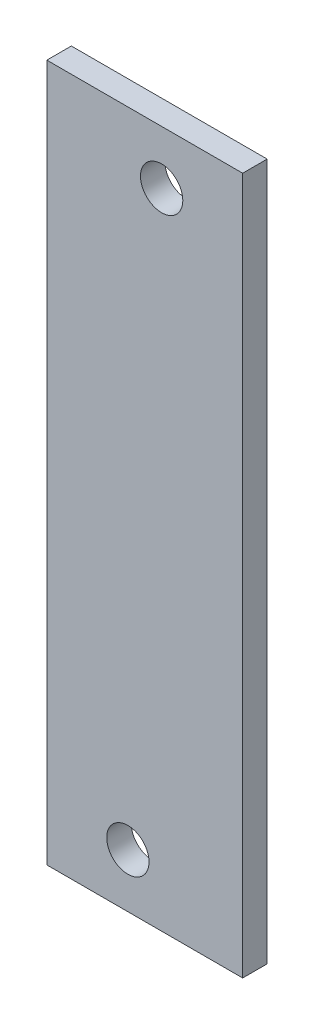
ISO-10303-21;
HEADER;
FILE_DESCRIPTION(('STEP AP214'),'2;1');
FILE_NAME('part.step','',(''),(''),'','','');
FILE_SCHEMA(('AUTOMOTIVE_DESIGN { 1 0 10303 214 1 1 1 1 }'));
ENDSEC;
DATA;
#1=APPLICATION_CONTEXT('core data for automotive mechanical design processes');
#2=APPLICATION_PROTOCOL_DEFINITION('international standard','automotive_design',2000,#1);
#3=PRODUCT_CONTEXT('',#1,'mechanical');
#4=PRODUCT('Part','Part','',(#3));
#5=PRODUCT_RELATED_PRODUCT_CATEGORY('part','',(#4));
#6=PRODUCT_DEFINITION_FORMATION('','',#4);
#7=PRODUCT_DEFINITION_CONTEXT('part definition',#1,'design');
#8=PRODUCT_DEFINITION('design','',#6,#7);
#9=PRODUCT_DEFINITION_SHAPE('','',#8);
#10=(LENGTH_UNIT() NAMED_UNIT(*) SI_UNIT(.MILLI.,.METRE.));
#11=(NAMED_UNIT(*) PLANE_ANGLE_UNIT() SI_UNIT($,.RADIAN.));
#12=(NAMED_UNIT(*) SI_UNIT($,.STERADIAN.) SOLID_ANGLE_UNIT());
#13=UNCERTAINTY_MEASURE_WITH_UNIT(LENGTH_MEASURE(1.E-05),#10,'distance_accuracy_value','');
#14=(GEOMETRIC_REPRESENTATION_CONTEXT(3) GLOBAL_UNCERTAINTY_ASSIGNED_CONTEXT((#13)) GLOBAL_UNIT_ASSIGNED_CONTEXT((#10,
#11,#12)) REPRESENTATION_CONTEXT('',''));
#15=CARTESIAN_POINT('',(0.,0.,0.));
#16=DIRECTION('',(0.,0.,1.));
#17=DIRECTION('',(1.,0.,0.));
#18=AXIS2_PLACEMENT_3D('',#15,#16,#17);
#19=CARTESIAN_POINT('',(0.,0.,3.5));
#20=DIRECTION('',(0.,0.,1.));
#21=DIRECTION('',(1.,0.,0.));
#22=AXIS2_PLACEMENT_3D('',#19,#20,#21);
#23=PLANE('',#22);
#24=CARTESIAN_POINT('',(-2.41299999999999,-42.164,3.5));
#25=DIRECTION('',(0.,0.,1.));
#26=DIRECTION('',(1.,0.,0.));
#27=AXIS2_PLACEMENT_3D('',#24,#25,#26);
#28=CIRCLE('',#27,3.025);
#29=CARTESIAN_POINT('',(0.612000000000011,-42.164,3.5));
#30=VERTEX_POINT('',#29);
#31=EDGE_CURVE('E102',#30,#30,#28,.T.);
#32=ORIENTED_EDGE('',*,*,#31,.F.);
#33=EDGE_LOOP('',(#32));
#34=FACE_BOUND('',#33,.T.);
#35=DIRECTION('',(0.,1.,0.));
#36=VECTOR('',#35,1.);
#37=CARTESIAN_POINT('',(14.,49.83,3.5));
#38=LINE('',#37,#36);
#39=CARTESIAN_POINT('',(14.,-49.83,3.5));
#40=VERTEX_POINT('',#39);
#41=CARTESIAN_POINT('',(14.,49.83,3.5));
#42=VERTEX_POINT('',#41);
#43=EDGE_CURVE('E87',#40,#42,#38,.T.);
#44=ORIENTED_EDGE('',*,*,#43,.T.);
#45=DIRECTION('',(-1.,0.,0.));
#46=VECTOR('',#45,1.);
#47=CARTESIAN_POINT('',(-14.,49.83,3.5));
#48=LINE('',#47,#46);
#49=CARTESIAN_POINT('',(-14.,49.83,3.5));
#50=VERTEX_POINT('',#49);
#51=EDGE_CURVE('E82',#42,#50,#48,.T.);
#52=ORIENTED_EDGE('',*,*,#51,.T.);
#53=DIRECTION('',(0.,-1.,0.));
#54=VECTOR('',#53,1.);
#55=CARTESIAN_POINT('',(-14.,49.83,3.5));
#56=LINE('',#55,#54);
#57=CARTESIAN_POINT('',(-14.,-49.83,3.5));
#58=VERTEX_POINT('',#57);
#59=EDGE_CURVE('E85',#50,#58,#56,.T.);
#60=ORIENTED_EDGE('',*,*,#59,.T.);
#61=DIRECTION('',(1.,0.,0.));
#62=VECTOR('',#61,1.);
#63=CARTESIAN_POINT('',(-14.,-49.83,3.5));
#64=LINE('',#63,#62);
#65=EDGE_CURVE('E52',#58,#40,#64,.T.);
#66=ORIENTED_EDGE('',*,*,#65,.T.);
#67=EDGE_LOOP('',(#44,#52,#60,#66));
#68=FACE_BOUND('',#67,.T.);
#69=CARTESIAN_POINT('',(2.413,42.164,3.5));
#70=DIRECTION('',(0.,0.,1.));
#71=DIRECTION('',(1.,0.,0.));
#72=AXIS2_PLACEMENT_3D('',#69,#70,#71);
#73=CIRCLE('',#72,3.025);
#74=CARTESIAN_POINT('',(5.438,42.164,3.5));
#75=VERTEX_POINT('',#74);
#76=EDGE_CURVE('E117',#75,#75,#73,.T.);
#77=ORIENTED_EDGE('',*,*,#76,.F.);
#78=EDGE_LOOP('',(#77));
#79=FACE_BOUND('',#78,.T.);
#80=ADVANCED_FACE('F35',(#34,#68,#79),#23,.T.);
#81=CARTESIAN_POINT('',(0.,0.,0.));
#82=DIRECTION('',(0.,0.,1.));
#83=DIRECTION('',(1.,0.,0.));
#84=AXIS2_PLACEMENT_3D('',#81,#82,#83);
#85=PLANE('',#84);
#86=DIRECTION('',(0.,1.,0.));
#87=VECTOR('',#86,1.);
#88=CARTESIAN_POINT('',(14.,49.83,0.));
#89=LINE('',#88,#87);
#90=CARTESIAN_POINT('',(14.,-49.83,0.));
#91=VERTEX_POINT('',#90);
#92=CARTESIAN_POINT('',(14.,49.83,0.));
#93=VERTEX_POINT('',#92);
#94=EDGE_CURVE('E99',#91,#93,#89,.T.);
#95=ORIENTED_EDGE('',*,*,#94,.F.);
#96=DIRECTION('',(1.,0.,0.));
#97=VECTOR('',#96,1.);
#98=CARTESIAN_POINT('',(-14.,-49.83,0.));
#99=LINE('',#98,#97);
#100=CARTESIAN_POINT('',(-14.,-49.83,0.));
#101=VERTEX_POINT('',#100);
#102=EDGE_CURVE('E75',#101,#91,#99,.T.);
#103=ORIENTED_EDGE('',*,*,#102,.F.);
#104=DIRECTION('',(0.,-1.,0.));
#105=VECTOR('',#104,1.);
#106=CARTESIAN_POINT('',(-14.,49.83,0.));
#107=LINE('',#106,#105);
#108=CARTESIAN_POINT('',(-14.,49.83,0.));
#109=VERTEX_POINT('',#108);
#110=EDGE_CURVE('E69',#109,#101,#107,.T.);
#111=ORIENTED_EDGE('',*,*,#110,.F.);
#112=DIRECTION('',(-1.,0.,0.));
#113=VECTOR('',#112,1.);
#114=CARTESIAN_POINT('',(-14.,49.83,0.));
#115=LINE('',#114,#113);
#116=EDGE_CURVE('E91',#93,#109,#115,.T.);
#117=ORIENTED_EDGE('',*,*,#116,.F.);
#118=EDGE_LOOP('',(#95,#103,#111,#117));
#119=FACE_BOUND('',#118,.T.);
#120=CARTESIAN_POINT('',(-2.41299999999999,-42.164,0.));
#121=DIRECTION('',(0.,0.,1.));
#122=DIRECTION('',(1.,0.,0.));
#123=AXIS2_PLACEMENT_3D('',#120,#121,#122);
#124=CIRCLE('',#123,3.025);
#125=CARTESIAN_POINT('',(0.612000000000011,-42.164,0.));
#126=VERTEX_POINT('',#125);
#127=EDGE_CURVE('E114',#126,#126,#124,.T.);
#128=ORIENTED_EDGE('',*,*,#127,.T.);
#129=EDGE_LOOP('',(#128));
#130=FACE_BOUND('',#129,.T.);
#131=CARTESIAN_POINT('',(2.413,42.164,0.));
#132=DIRECTION('',(0.,0.,1.));
#133=DIRECTION('',(1.,0.,0.));
#134=AXIS2_PLACEMENT_3D('',#131,#132,#133);
#135=CIRCLE('',#134,3.025);
#136=CARTESIAN_POINT('',(5.438,42.164,0.));
#137=VERTEX_POINT('',#136);
#138=EDGE_CURVE('E120',#137,#137,#135,.T.);
#139=ORIENTED_EDGE('',*,*,#138,.T.);
#140=EDGE_LOOP('',(#139));
#141=FACE_BOUND('',#140,.T.);
#142=ADVANCED_FACE('F110',(#119,#130,#141),#85,.F.);
#143=CARTESIAN_POINT('',(14.,49.83,3.5));
#144=DIRECTION('',(-1.,0.,0.));
#145=DIRECTION('',(0.,-1.,0.));
#146=AXIS2_PLACEMENT_3D('',#143,#144,#145);
#147=PLANE('',#146);
#148=ORIENTED_EDGE('',*,*,#94,.T.);
#149=DIRECTION('',(0.,0.,-1.));
#150=VECTOR('',#149,1.);
#151=CARTESIAN_POINT('',(14.,49.83,3.5));
#152=LINE('',#151,#150);
#153=EDGE_CURVE('E11',#42,#93,#152,.T.);
#154=ORIENTED_EDGE('',*,*,#153,.F.);
#155=ORIENTED_EDGE('',*,*,#43,.F.);
#156=DIRECTION('',(0.,0.,-1.));
#157=VECTOR('',#156,1.);
#158=CARTESIAN_POINT('',(14.,-49.83,3.5));
#159=LINE('',#158,#157);
#160=EDGE_CURVE('E95',#40,#91,#159,.T.);
#161=ORIENTED_EDGE('',*,*,#160,.T.);
#162=EDGE_LOOP('',(#148,#154,#155,#161));
#163=FACE_BOUND('',#162,.T.);
#164=ADVANCED_FACE('F37',(#163),#147,.F.);
#165=CARTESIAN_POINT('',(-14.,49.83,3.5));
#166=DIRECTION('',(0.,-1.,0.));
#167=DIRECTION('',(0.,0.,-1.));
#168=AXIS2_PLACEMENT_3D('',#165,#166,#167);
#169=PLANE('',#168);
#170=ORIENTED_EDGE('',*,*,#116,.T.);
#171=DIRECTION('',(0.,0.,-1.));
#172=VECTOR('',#171,1.);
#173=CARTESIAN_POINT('',(-14.,49.83,3.5));
#174=LINE('',#173,#172);
#175=EDGE_CURVE('E44',#50,#109,#174,.T.);
#176=ORIENTED_EDGE('',*,*,#175,.F.);
#177=ORIENTED_EDGE('',*,*,#51,.F.);
#178=ORIENTED_EDGE('',*,*,#153,.T.);
#179=EDGE_LOOP('',(#170,#176,#177,#178));
#180=FACE_BOUND('',#179,.T.);
#181=ADVANCED_FACE('F90',(#180),#169,.F.);
#182=CARTESIAN_POINT('',(-14.,49.83,3.5));
#183=DIRECTION('',(1.,0.,0.));
#184=DIRECTION('',(0.,1.,0.));
#185=AXIS2_PLACEMENT_3D('',#182,#183,#184);
#186=PLANE('',#185);
#187=ORIENTED_EDGE('',*,*,#110,.T.);
#188=DIRECTION('',(0.,0.,-1.));
#189=VECTOR('',#188,1.);
#190=CARTESIAN_POINT('',(-14.,-49.83,3.5));
#191=LINE('',#190,#189);
#192=EDGE_CURVE('E92',#58,#101,#191,.T.);
#193=ORIENTED_EDGE('',*,*,#192,.F.);
#194=ORIENTED_EDGE('',*,*,#59,.F.);
#195=ORIENTED_EDGE('',*,*,#175,.T.);
#196=EDGE_LOOP('',(#187,#193,#194,#195));
#197=FACE_BOUND('',#196,.T.);
#198=ADVANCED_FACE('F93',(#197),#186,.F.);
#199=CARTESIAN_POINT('',(-14.,-49.83,3.5));
#200=DIRECTION('',(0.,1.,0.));
#201=DIRECTION('',(0.,0.,1.));
#202=AXIS2_PLACEMENT_3D('',#199,#200,#201);
#203=PLANE('',#202);
#204=ORIENTED_EDGE('',*,*,#102,.T.);
#205=ORIENTED_EDGE('',*,*,#160,.F.);
#206=ORIENTED_EDGE('',*,*,#65,.F.);
#207=ORIENTED_EDGE('',*,*,#192,.T.);
#208=EDGE_LOOP('',(#204,#205,#206,#207));
#209=FACE_BOUND('',#208,.T.);
#210=ADVANCED_FACE('F107',(#209),#203,.F.);
#211=CARTESIAN_POINT('',(-2.41299999999999,-42.164,3.5));
#212=DIRECTION('',(0.,0.,-1.));
#213=DIRECTION('',(-1.,0.,0.));
#214=AXIS2_PLACEMENT_3D('',#211,#212,#213);
#215=CYLINDRICAL_SURFACE('',#214,3.025);
#216=ORIENTED_EDGE('',*,*,#31,.T.);
#217=EDGE_LOOP('',(#216));
#218=FACE_BOUND('',#217,.T.);
#219=ORIENTED_EDGE('',*,*,#127,.F.);
#220=EDGE_LOOP('',(#219));
#221=FACE_BOUND('',#220,.T.);
#222=ADVANCED_FACE('F137',(#218,#221),#215,.F.);
#223=CARTESIAN_POINT('',(2.413,42.164,3.5));
#224=DIRECTION('',(0.,0.,-1.));
#225=DIRECTION('',(-1.,0.,0.));
#226=AXIS2_PLACEMENT_3D('',#223,#224,#225);
#227=CYLINDRICAL_SURFACE('',#226,3.025);
#228=ORIENTED_EDGE('',*,*,#76,.T.);
#229=EDGE_LOOP('',(#228));
#230=FACE_BOUND('',#229,.T.);
#231=ORIENTED_EDGE('',*,*,#138,.F.);
#232=EDGE_LOOP('',(#231));
#233=FACE_BOUND('',#232,.T.);
#234=ADVANCED_FACE('F126',(#230,#233),#227,.F.);
#235=CLOSED_SHELL('',(#80,#142,#164,#181,#198,#210,#222,#234));
#236=MANIFOLD_SOLID_BREP('B2',#235);
#237=ADVANCED_BREP_SHAPE_REPRESENTATION('',(#18,#236),#14);
#238=SHAPE_DEFINITION_REPRESENTATION(#9,#237);
ENDSEC;
END-ISO-10303-21;
